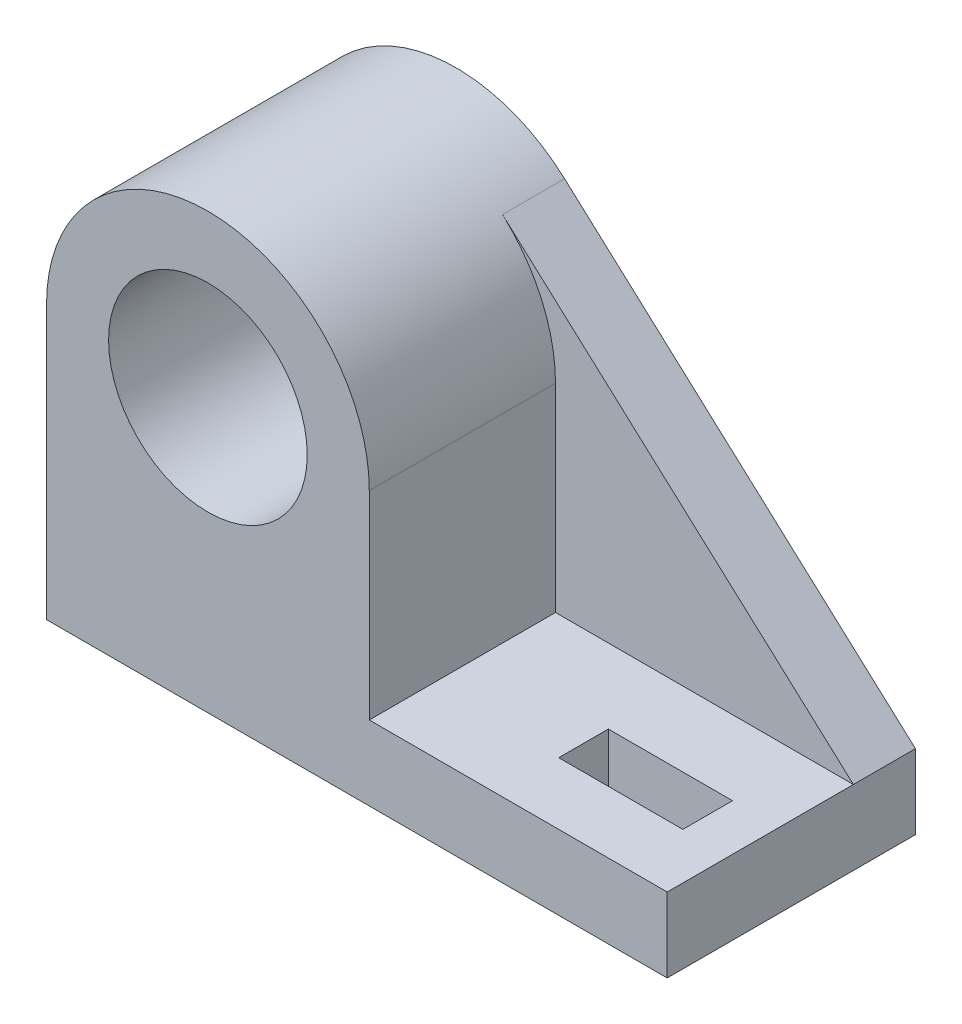
ISO-10303-21;
HEADER;
FILE_DESCRIPTION(('STEP AP214'),'2;1');
FILE_NAME('part.step','',(''),(''),'','','');
FILE_SCHEMA(('AUTOMOTIVE_DESIGN { 1 0 10303 214 1 1 1 1 }'));
ENDSEC;
DATA;
#1=APPLICATION_CONTEXT('core data for automotive mechanical design processes');
#2=APPLICATION_PROTOCOL_DEFINITION('international standard','automotive_design',2000,#1);
#3=PRODUCT_CONTEXT('',#1,'mechanical');
#4=PRODUCT('Part','Part','',(#3));
#5=PRODUCT_RELATED_PRODUCT_CATEGORY('part','',(#4));
#6=PRODUCT_DEFINITION_FORMATION('','',#4);
#7=PRODUCT_DEFINITION_CONTEXT('part definition',#1,'design');
#8=PRODUCT_DEFINITION('design','',#6,#7);
#9=PRODUCT_DEFINITION_SHAPE('','',#8);
#10=(LENGTH_UNIT() NAMED_UNIT(*) SI_UNIT(.MILLI.,.METRE.));
#11=(NAMED_UNIT(*) PLANE_ANGLE_UNIT() SI_UNIT($,.RADIAN.));
#12=(NAMED_UNIT(*) SI_UNIT($,.STERADIAN.) SOLID_ANGLE_UNIT());
#13=UNCERTAINTY_MEASURE_WITH_UNIT(LENGTH_MEASURE(1.E-05),#10,'distance_accuracy_value','');
#14=(GEOMETRIC_REPRESENTATION_CONTEXT(3) GLOBAL_UNCERTAINTY_ASSIGNED_CONTEXT((#13)) GLOBAL_UNIT_ASSIGNED_CONTEXT((#10,
#11,#12)) REPRESENTATION_CONTEXT('',''));
#15=CARTESIAN_POINT('',(0.,0.,0.));
#16=DIRECTION('',(0.,0.,1.));
#17=DIRECTION('',(1.,0.,0.));
#18=AXIS2_PLACEMENT_3D('',#15,#16,#17);
#19=CARTESIAN_POINT('',(-44.9626865671642,12.,-40.));
#20=DIRECTION('',(-1.,0.,0.));
#21=DIRECTION('',(0.,0.,1.));
#22=AXIS2_PLACEMENT_3D('',#19,#20,#21);
#23=PLANE('',#22);
#24=DIRECTION('',(0.,-1.,0.));
#25=VECTOR('',#24,1.);
#26=CARTESIAN_POINT('',(-44.9626865671642,12.,0.));
#27=LINE('',#26,#25);
#28=CARTESIAN_POINT('',(-44.9626865671642,44.,0.));
#29=VERTEX_POINT('',#28);
#30=CARTESIAN_POINT('',(-44.9626865671642,0.,0.));
#31=VERTEX_POINT('',#30);
#32=EDGE_CURVE('E177',#29,#31,#27,.T.);
#33=ORIENTED_EDGE('',*,*,#32,.F.);
#34=DIRECTION('',(0.,0.,1.));
#35=VECTOR('',#34,1.);
#36=CARTESIAN_POINT('',(-44.9626865671642,44.,-40.));
#37=LINE('',#36,#35);
#38=CARTESIAN_POINT('',(-44.9626865671642,44.,-40.));
#39=VERTEX_POINT('',#38);
#40=EDGE_CURVE('E201',#39,#29,#37,.T.);
#41=ORIENTED_EDGE('',*,*,#40,.F.);
#42=DIRECTION('',(0.,-1.,0.));
#43=VECTOR('',#42,1.);
#44=CARTESIAN_POINT('',(-44.9626865671642,0.,-40.));
#45=LINE('',#44,#43);
#46=CARTESIAN_POINT('',(-44.9626865671642,0.,-40.));
#47=VERTEX_POINT('',#46);
#48=EDGE_CURVE('E173',#39,#47,#45,.T.);
#49=ORIENTED_EDGE('',*,*,#48,.T.);
#50=DIRECTION('',(0.,0.,1.));
#51=VECTOR('',#50,1.);
#52=CARTESIAN_POINT('',(-44.9626865671642,0.,-40.));
#53=LINE('',#52,#51);
#54=EDGE_CURVE('E184',#47,#31,#53,.T.);
#55=ORIENTED_EDGE('',*,*,#54,.T.);
#56=EDGE_LOOP('',(#33,#41,#49,#55));
#57=FACE_BOUND('',#56,.T.);
#58=ADVANCED_FACE('F36',(#57),#23,.T.);
#59=CARTESIAN_POINT('',(-18.9626865671642,44.,-40.));
#60=DIRECTION('',(0.,0.,1.));
#61=DIRECTION('',(1.,0.,0.));
#62=AXIS2_PLACEMENT_3D('',#59,#60,#61);
#63=CYLINDRICAL_SURFACE('',#62,26.);
#64=CARTESIAN_POINT('',(-18.9626865671642,44.,-30.));
#65=DIRECTION('',(0.,0.,1.));
#66=DIRECTION('',(1.,0.,0.));
#67=AXIS2_PLACEMENT_3D('',#64,#65,#66);
#68=CIRCLE('',#67,26.);
#69=CARTESIAN_POINT('',(-1.49834914465468,63.2612802895533,-30.));
#70=VERTEX_POINT('',#69);
#71=CARTESIAN_POINT('',(7.03731343283581,44.,-30.));
#72=VERTEX_POINT('',#71);
#73=EDGE_CURVE('E161',#70,#72,#68,.F.);
#74=ORIENTED_EDGE('',*,*,#73,.F.);
#75=DIRECTION('',(0.,0.,1.));
#76=VECTOR('',#75,1.);
#77=CARTESIAN_POINT('',(-1.49834914465467,63.2612802895533,-40.));
#78=LINE('',#77,#76);
#79=CARTESIAN_POINT('',(-1.49834914465468,63.2612802895533,-40.));
#80=VERTEX_POINT('',#79);
#81=EDGE_CURVE('E164',#70,#80,#78,.F.);
#82=ORIENTED_EDGE('',*,*,#81,.T.);
#83=CARTESIAN_POINT('',(-18.9626865671642,44.,-40.));
#84=DIRECTION('',(0.,0.,1.));
#85=DIRECTION('',(-1.,0.,0.));
#86=AXIS2_PLACEMENT_3D('',#83,#84,#85);
#87=CIRCLE('',#86,26.);
#88=EDGE_CURVE('E182',#80,#39,#87,.T.);
#89=ORIENTED_EDGE('',*,*,#88,.T.);
#90=ORIENTED_EDGE('',*,*,#40,.T.);
#91=CARTESIAN_POINT('',(-18.9626865671642,44.,0.));
#92=DIRECTION('',(0.,0.,1.));
#93=DIRECTION('',(-1.,0.,0.));
#94=AXIS2_PLACEMENT_3D('',#91,#92,#93);
#95=CIRCLE('',#94,26.);
#96=CARTESIAN_POINT('',(7.03731343283581,44.,0.));
#97=VERTEX_POINT('',#96);
#98=EDGE_CURVE('E196',#97,#29,#95,.T.);
#99=ORIENTED_EDGE('',*,*,#98,.F.);
#100=DIRECTION('',(0.,0.,1.));
#101=VECTOR('',#100,1.);
#102=CARTESIAN_POINT('',(7.03731343283581,44.,-40.));
#103=LINE('',#102,#101);
#104=EDGE_CURVE('E204',#72,#97,#103,.T.);
#105=ORIENTED_EDGE('',*,*,#104,.F.);
#106=EDGE_LOOP('',(#74,#82,#89,#90,#99,#105));
#107=FACE_BOUND('',#106,.T.);
#108=ADVANCED_FACE('F237',(#107),#63,.T.);
#109=CARTESIAN_POINT('',(7.03731343283581,12.,-40.));
#110=DIRECTION('',(1.,0.,0.));
#111=DIRECTION('',(0.,0.,-1.));
#112=AXIS2_PLACEMENT_3D('',#109,#110,#111);
#113=PLANE('',#112);
#114=DIRECTION('',(0.,-1.,0.));
#115=VECTOR('',#114,1.);
#116=CARTESIAN_POINT('',(7.03731343283581,12.,-30.));
#117=LINE('',#116,#115);
#118=CARTESIAN_POINT('',(7.03731343283581,12.,-30.));
#119=VERTEX_POINT('',#118);
#120=EDGE_CURVE('E158',#72,#119,#117,.T.);
#121=ORIENTED_EDGE('',*,*,#120,.F.);
#122=ORIENTED_EDGE('',*,*,#104,.T.);
#123=DIRECTION('',(0.,1.,0.));
#124=VECTOR('',#123,1.);
#125=CARTESIAN_POINT('',(7.03731343283581,12.,0.));
#126=LINE('',#125,#124);
#127=CARTESIAN_POINT('',(7.03731343283581,12.,0.));
#128=VERTEX_POINT('',#127);
#129=EDGE_CURVE('E193',#128,#97,#126,.T.);
#130=ORIENTED_EDGE('',*,*,#129,.F.);
#131=DIRECTION('',(0.,0.,1.));
#132=VECTOR('',#131,1.);
#133=CARTESIAN_POINT('',(7.03731343283581,12.,-40.));
#134=LINE('',#133,#132);
#135=EDGE_CURVE('E206',#119,#128,#134,.T.);
#136=ORIENTED_EDGE('',*,*,#135,.F.);
#137=EDGE_LOOP('',(#121,#122,#130,#136));
#138=FACE_BOUND('',#137,.T.);
#139=ADVANCED_FACE('F243',(#138),#113,.T.);
#140=CARTESIAN_POINT('',(7.03731343283581,12.,-40.));
#141=DIRECTION('',(0.,1.,0.));
#142=DIRECTION('',(0.,0.,1.));
#143=AXIS2_PLACEMENT_3D('',#140,#141,#142);
#144=PLANE('',#143);
#145=DIRECTION('',(0.,0.,-1.));
#146=VECTOR('',#145,1.);
#147=CARTESIAN_POINT('',(47.5595856633928,12.,-18.));
#148=LINE('',#147,#146);
#149=CARTESIAN_POINT('',(47.5595856633928,12.,-10.));
#150=VERTEX_POINT('',#149);
#151=CARTESIAN_POINT('',(47.5595856633928,12.,-18.));
#152=VERTEX_POINT('',#151);
#153=EDGE_CURVE('E51',#150,#152,#148,.T.);
#154=ORIENTED_EDGE('',*,*,#153,.F.);
#155=DIRECTION('',(1.,0.,0.));
#156=VECTOR('',#155,1.);
#157=CARTESIAN_POINT('',(27.5595856633928,12.,-10.));
#158=LINE('',#157,#156);
#159=CARTESIAN_POINT('',(27.5595856633928,12.,-10.));
#160=VERTEX_POINT('',#159);
#161=EDGE_CURVE('E140',#160,#150,#158,.T.);
#162=ORIENTED_EDGE('',*,*,#161,.F.);
#163=DIRECTION('',(0.,0.,1.));
#164=VECTOR('',#163,1.);
#165=CARTESIAN_POINT('',(27.5595856633928,12.,-10.));
#166=LINE('',#165,#164);
#167=CARTESIAN_POINT('',(27.5595856633928,12.,-18.));
#168=VERTEX_POINT('',#167);
#169=EDGE_CURVE('E124',#168,#160,#166,.T.);
#170=ORIENTED_EDGE('',*,*,#169,.F.);
#171=DIRECTION('',(-1.,0.,0.));
#172=VECTOR('',#171,1.);
#173=CARTESIAN_POINT('',(47.5595856633928,12.,-18.));
#174=LINE('',#173,#172);
#175=EDGE_CURVE('E133',#152,#168,#174,.T.);
#176=ORIENTED_EDGE('',*,*,#175,.F.);
#177=EDGE_LOOP('',(#154,#162,#170,#176));
#178=FACE_BOUND('',#177,.T.);
#179=DIRECTION('',(1.,0.,0.));
#180=VECTOR('',#179,1.);
#181=CARTESIAN_POINT('',(7.03731343283581,12.,-30.));
#182=LINE('',#181,#180);
#183=CARTESIAN_POINT('',(55.0373134328358,12.,-30.));
#184=VERTEX_POINT('',#183);
#185=EDGE_CURVE('E153',#119,#184,#182,.T.);
#186=ORIENTED_EDGE('',*,*,#185,.F.);
#187=ORIENTED_EDGE('',*,*,#135,.T.);
#188=DIRECTION('',(-1.,0.,0.));
#189=VECTOR('',#188,1.);
#190=CARTESIAN_POINT('',(7.03731343283581,12.,0.));
#191=LINE('',#190,#189);
#192=CARTESIAN_POINT('',(55.0373134328358,12.,0.));
#193=VERTEX_POINT('',#192);
#194=EDGE_CURVE('E190',#193,#128,#191,.T.);
#195=ORIENTED_EDGE('',*,*,#194,.F.);
#196=DIRECTION('',(0.,0.,1.));
#197=VECTOR('',#196,1.);
#198=CARTESIAN_POINT('',(55.0373134328358,12.,-40.));
#199=LINE('',#198,#197);
#200=EDGE_CURVE('E211',#184,#193,#199,.T.);
#201=ORIENTED_EDGE('',*,*,#200,.F.);
#202=EDGE_LOOP('',(#186,#187,#195,#201));
#203=FACE_BOUND('',#202,.T.);
#204=ADVANCED_FACE('F137',(#178,#203),#144,.T.);
#205=CARTESIAN_POINT('',(55.0373134328358,0.,-40.));
#206=DIRECTION('',(1.,0.,0.));
#207=DIRECTION('',(0.,0.,-1.));
#208=AXIS2_PLACEMENT_3D('',#205,#206,#207);
#209=PLANE('',#208);
#210=DIRECTION('',(0.,1.,0.));
#211=VECTOR('',#210,1.);
#212=CARTESIAN_POINT('',(55.0373134328358,0.,0.));
#213=LINE('',#212,#211);
#214=CARTESIAN_POINT('',(55.0373134328358,0.,0.));
#215=VERTEX_POINT('',#214);
#216=EDGE_CURVE('E187',#215,#193,#213,.T.);
#217=ORIENTED_EDGE('',*,*,#216,.F.);
#218=DIRECTION('',(0.,0.,1.));
#219=VECTOR('',#218,1.);
#220=CARTESIAN_POINT('',(55.0373134328358,0.,-40.));
#221=LINE('',#220,#219);
#222=CARTESIAN_POINT('',(55.0373134328358,0.,-40.));
#223=VERTEX_POINT('',#222);
#224=EDGE_CURVE('E212',#223,#215,#221,.T.);
#225=ORIENTED_EDGE('',*,*,#224,.F.);
#226=DIRECTION('',(0.,1.,0.));
#227=VECTOR('',#226,1.);
#228=CARTESIAN_POINT('',(55.0373134328358,0.,-40.));
#229=LINE('',#228,#227);
#230=CARTESIAN_POINT('',(55.0373134328358,12.,-40.));
#231=VERTEX_POINT('',#230);
#232=EDGE_CURVE('E180',#223,#231,#229,.T.);
#233=ORIENTED_EDGE('',*,*,#232,.T.);
#234=EDGE_CURVE('E208',#231,#184,#199,.T.);
#235=ORIENTED_EDGE('',*,*,#234,.T.);
#236=ORIENTED_EDGE('',*,*,#200,.T.);
#237=EDGE_LOOP('',(#217,#225,#233,#235,#236));
#238=FACE_BOUND('',#237,.T.);
#239=ADVANCED_FACE('F255',(#238),#209,.T.);
#240=CARTESIAN_POINT('',(-44.9626865671642,0.,-40.));
#241=DIRECTION('',(0.,-1.,0.));
#242=DIRECTION('',(0.,0.,-1.));
#243=AXIS2_PLACEMENT_3D('',#240,#241,#242);
#244=PLANE('',#243);
#245=DIRECTION('',(0.,0.,1.));
#246=VECTOR('',#245,1.);
#247=CARTESIAN_POINT('',(47.5595856633928,0.,-40.));
#248=LINE('',#247,#246);
#249=CARTESIAN_POINT('',(47.5595856633928,0.,-18.));
#250=VERTEX_POINT('',#249);
#251=CARTESIAN_POINT('',(47.5595856633928,0.,-10.));
#252=VERTEX_POINT('',#251);
#253=EDGE_CURVE('E11',#250,#252,#248,.T.);
#254=ORIENTED_EDGE('',*,*,#253,.F.);
#255=DIRECTION('',(1.,0.,0.));
#256=VECTOR('',#255,1.);
#257=CARTESIAN_POINT('',(-44.9626865671642,0.,-18.));
#258=LINE('',#257,#256);
#259=CARTESIAN_POINT('',(27.5595856633928,0.,-18.));
#260=VERTEX_POINT('',#259);
#261=EDGE_CURVE('E203',#260,#250,#258,.T.);
#262=ORIENTED_EDGE('',*,*,#261,.F.);
#263=DIRECTION('',(0.,0.,-1.));
#264=VECTOR('',#263,1.);
#265=CARTESIAN_POINT('',(27.5595856633928,0.,-40.));
#266=LINE('',#265,#264);
#267=CARTESIAN_POINT('',(27.5595856633928,0.,-10.));
#268=VERTEX_POINT('',#267);
#269=EDGE_CURVE('E127',#268,#260,#266,.T.);
#270=ORIENTED_EDGE('',*,*,#269,.F.);
#271=DIRECTION('',(-1.,0.,0.));
#272=VECTOR('',#271,1.);
#273=CARTESIAN_POINT('',(-44.9626865671642,0.,-9.99999999999999));
#274=LINE('',#273,#272);
#275=EDGE_CURVE('E44',#252,#268,#274,.T.);
#276=ORIENTED_EDGE('',*,*,#275,.F.);
#277=EDGE_LOOP('',(#254,#262,#270,#276));
#278=FACE_BOUND('',#277,.T.);
#279=DIRECTION('',(1.,0.,0.));
#280=VECTOR('',#279,1.);
#281=CARTESIAN_POINT('',(-44.9626865671642,0.,0.));
#282=LINE('',#281,#280);
#283=EDGE_CURVE('E170',#31,#215,#282,.T.);
#284=ORIENTED_EDGE('',*,*,#283,.F.);
#285=ORIENTED_EDGE('',*,*,#54,.F.);
#286=DIRECTION('',(1.,0.,0.));
#287=VECTOR('',#286,1.);
#288=CARTESIAN_POINT('',(-44.9626865671642,0.,-40.));
#289=LINE('',#288,#287);
#290=EDGE_CURVE('E176',#47,#223,#289,.T.);
#291=ORIENTED_EDGE('',*,*,#290,.T.);
#292=ORIENTED_EDGE('',*,*,#224,.T.);
#293=EDGE_LOOP('',(#284,#285,#291,#292));
#294=FACE_BOUND('',#293,.T.);
#295=ADVANCED_FACE('F38',(#278,#294),#244,.T.);
#296=CARTESIAN_POINT('',(-18.9626865671642,44.,-40.));
#297=DIRECTION('',(0.,0.,-1.));
#298=DIRECTION('',(-1.,0.,0.));
#299=AXIS2_PLACEMENT_3D('',#296,#297,#298);
#300=PLANE('',#299);
#301=ORIENTED_EDGE('',*,*,#88,.F.);
#302=DIRECTION('',(-0.740818472675126,0.671705285481135,0.));
#303=VECTOR('',#302,1.);
#304=CARTESIAN_POINT('',(55.0373134328358,12.,-40.));
#305=LINE('',#304,#303);
#306=EDGE_CURVE('E147',#231,#80,#305,.T.);
#307=ORIENTED_EDGE('',*,*,#306,.F.);
#308=ORIENTED_EDGE('',*,*,#232,.F.);
#309=ORIENTED_EDGE('',*,*,#290,.F.);
#310=ORIENTED_EDGE('',*,*,#48,.F.);
#311=EDGE_LOOP('',(#301,#307,#308,#309,#310));
#312=FACE_BOUND('',#311,.T.);
#313=CARTESIAN_POINT('',(-18.9626865671642,44.,-40.));
#314=DIRECTION('',(0.,0.,1.));
#315=DIRECTION('',(1.,0.,0.));
#316=AXIS2_PLACEMENT_3D('',#313,#314,#315);
#317=CIRCLE('',#316,16.);
#318=CARTESIAN_POINT('',(-2.96268656716419,44.,-40.));
#319=VERTEX_POINT('',#318);
#320=EDGE_CURVE('E167',#319,#319,#317,.T.);
#321=ORIENTED_EDGE('',*,*,#320,.T.);
#322=EDGE_LOOP('',(#321));
#323=FACE_BOUND('',#322,.T.);
#324=ADVANCED_FACE('F261',(#312,#323),#300,.T.);
#325=CARTESIAN_POINT('',(-18.9626865671642,44.,0.));
#326=DIRECTION('',(0.,0.,-1.));
#327=DIRECTION('',(-1.,0.,0.));
#328=AXIS2_PLACEMENT_3D('',#325,#326,#327);
#329=PLANE('',#328);
#330=CARTESIAN_POINT('',(-18.9626865671642,44.,0.));
#331=DIRECTION('',(0.,0.,1.));
#332=DIRECTION('',(1.,0.,0.));
#333=AXIS2_PLACEMENT_3D('',#330,#331,#332);
#334=CIRCLE('',#333,16.);
#335=CARTESIAN_POINT('',(-2.96268656716419,44.,0.));
#336=VERTEX_POINT('',#335);
#337=EDGE_CURVE('E166',#336,#336,#334,.T.);
#338=ORIENTED_EDGE('',*,*,#337,.F.);
#339=EDGE_LOOP('',(#338));
#340=FACE_BOUND('',#339,.T.);
#341=ORIENTED_EDGE('',*,*,#32,.T.);
#342=ORIENTED_EDGE('',*,*,#283,.T.);
#343=ORIENTED_EDGE('',*,*,#216,.T.);
#344=ORIENTED_EDGE('',*,*,#194,.T.);
#345=ORIENTED_EDGE('',*,*,#129,.T.);
#346=ORIENTED_EDGE('',*,*,#98,.T.);
#347=EDGE_LOOP('',(#341,#342,#343,#344,#345,#346));
#348=FACE_BOUND('',#347,.T.);
#349=ADVANCED_FACE('F248',(#340,#348),#329,.F.);
#350=CARTESIAN_POINT('',(-18.9626865671642,44.,-40.));
#351=DIRECTION('',(0.,0.,1.));
#352=DIRECTION('',(1.,0.,0.));
#353=AXIS2_PLACEMENT_3D('',#350,#351,#352);
#354=CYLINDRICAL_SURFACE('',#353,16.);
#355=CARTESIAN_POINT('',(-2.96268656716419,44.,0.));
#356=CARTESIAN_POINT('',(-2.96268656716419,44.,-0.416666666666667));
#357=CARTESIAN_POINT('',(-2.96268656716419,44.,-0.833333333333334));
#358=CARTESIAN_POINT('',(-2.96268656716419,44.,-1.66666666666667));
#359=CARTESIAN_POINT('',(-2.96268656716419,44.,-2.08333333333334));
#360=CARTESIAN_POINT('',(-2.96268656716419,44.,-2.91666666666667));
#361=CARTESIAN_POINT('',(-2.96268656716419,44.,-3.33333333333334));
#362=CARTESIAN_POINT('',(-2.96268656716419,44.,-4.16666666666667));
#363=CARTESIAN_POINT('',(-2.96268656716419,44.,-4.58333333333334));
#364=CARTESIAN_POINT('',(-2.96268656716419,44.,-5.41666666666667));
#365=CARTESIAN_POINT('',(-2.96268656716419,44.,-5.83333333333334));
#366=CARTESIAN_POINT('',(-2.96268656716419,44.,-6.66666666666667));
#367=CARTESIAN_POINT('',(-2.96268656716419,44.,-7.08333333333334));
#368=CARTESIAN_POINT('',(-2.96268656716419,44.,-7.91666666666667));
#369=CARTESIAN_POINT('',(-2.96268656716419,44.,-8.33333333333334));
#370=CARTESIAN_POINT('',(-2.96268656716419,44.,-9.16666666666667));
#371=CARTESIAN_POINT('',(-2.96268656716419,44.,-9.58333333333334));
#372=CARTESIAN_POINT('',(-2.96268656716419,44.,-10.4166666666667));
#373=CARTESIAN_POINT('',(-2.96268656716419,44.,-10.8333333333333));
#374=CARTESIAN_POINT('',(-2.96268656716419,44.,-11.6666666666667));
#375=CARTESIAN_POINT('',(-2.96268656716419,44.,-12.0833333333333));
#376=CARTESIAN_POINT('',(-2.96268656716419,44.,-12.9166666666667));
#377=CARTESIAN_POINT('',(-2.96268656716419,44.,-13.3333333333333));
#378=CARTESIAN_POINT('',(-2.96268656716419,44.,-14.1666666666667));
#379=CARTESIAN_POINT('',(-2.96268656716419,44.,-14.5833333333333));
#380=CARTESIAN_POINT('',(-2.96268656716419,44.,-15.4166666666667));
#381=CARTESIAN_POINT('',(-2.96268656716419,44.,-15.8333333333333));
#382=CARTESIAN_POINT('',(-2.96268656716419,44.,-16.6666666666667));
#383=CARTESIAN_POINT('',(-2.96268656716419,44.,-17.0833333333333));
#384=CARTESIAN_POINT('',(-2.96268656716419,44.,-17.9166666666667));
#385=CARTESIAN_POINT('',(-2.96268656716419,44.,-18.3333333333333));
#386=CARTESIAN_POINT('',(-2.96268656716419,44.,-19.1666666666667));
#387=CARTESIAN_POINT('',(-2.96268656716419,44.,-19.5833333333333));
#388=CARTESIAN_POINT('',(-2.96268656716419,44.,-20.4166666666667));
#389=CARTESIAN_POINT('',(-2.96268656716419,44.,-20.8333333333333));
#390=CARTESIAN_POINT('',(-2.96268656716419,44.,-21.6666666666667));
#391=CARTESIAN_POINT('',(-2.96268656716419,44.,-22.0833333333333));
#392=CARTESIAN_POINT('',(-2.96268656716419,44.,-22.9166666666667));
#393=CARTESIAN_POINT('',(-2.96268656716419,44.,-23.3333333333333));
#394=CARTESIAN_POINT('',(-2.96268656716419,44.,-24.1666666666667));
#395=CARTESIAN_POINT('',(-2.96268656716419,44.,-24.5833333333333));
#396=CARTESIAN_POINT('',(-2.96268656716419,44.,-25.4166666666667));
#397=CARTESIAN_POINT('',(-2.96268656716419,44.,-25.8333333333333));
#398=CARTESIAN_POINT('',(-2.96268656716419,44.,-26.6666666666667));
#399=CARTESIAN_POINT('',(-2.96268656716419,44.,-27.0833333333333));
#400=CARTESIAN_POINT('',(-2.96268656716419,44.,-27.9166666666667));
#401=CARTESIAN_POINT('',(-2.96268656716419,44.,-28.3333333333333));
#402=CARTESIAN_POINT('',(-2.96268656716419,44.,-29.1666666666667));
#403=CARTESIAN_POINT('',(-2.96268656716419,44.,-29.5833333333333));
#404=CARTESIAN_POINT('',(-2.96268656716419,44.,-30.4166666666667));
#405=CARTESIAN_POINT('',(-2.96268656716419,44.,-30.8333333333333));
#406=CARTESIAN_POINT('',(-2.96268656716419,44.,-31.6666666666667));
#407=CARTESIAN_POINT('',(-2.96268656716419,44.,-32.0833333333333));
#408=CARTESIAN_POINT('',(-2.96268656716419,44.,-32.9166666666667));
#409=CARTESIAN_POINT('',(-2.96268656716419,44.,-33.3333333333333));
#410=CARTESIAN_POINT('',(-2.96268656716419,44.,-34.1666666666667));
#411=CARTESIAN_POINT('',(-2.96268656716419,44.,-34.5833333333333));
#412=CARTESIAN_POINT('',(-2.96268656716419,44.,-35.4166666666667));
#413=CARTESIAN_POINT('',(-2.96268656716419,44.,-35.8333333333333));
#414=CARTESIAN_POINT('',(-2.96268656716419,44.,-36.6666666666667));
#415=CARTESIAN_POINT('',(-2.96268656716419,44.,-37.0833333333333));
#416=CARTESIAN_POINT('',(-2.96268656716419,44.,-37.9166666666667));
#417=CARTESIAN_POINT('',(-2.96268656716419,44.,-38.3333333333333));
#418=CARTESIAN_POINT('',(-2.96268656716419,44.,-39.1666666666667));
#419=CARTESIAN_POINT('',(-2.96268656716419,44.,-39.5833333333333));
#420=CARTESIAN_POINT('',(-2.96268656716419,44.,-40.));
#421=B_SPLINE_CURVE_WITH_KNOTS('',3,(#355,#356,#357,#358,#359,#360,#361,#362,#363,#364,#365,
#366,#367,#368,#369,#370,#371,#372,#373,#374,#375,#376,#377,#378,#379,#380,#381,#382,#383,#384,
#385,#386,#387,#388,#389,#390,#391,#392,#393,#394,#395,#396,#397,#398,#399,#400,#401,#402,#403,
#404,#405,#406,#407,#408,#409,#410,#411,#412,#413,#414,#415,#416,#417,#418,#419,#420),
.UNSPECIFIED.,.F.,.F.,(4,2,2,2,2,2,2,2,2,2,2,2,2,2,2,2,2,2,2,2,2,2,2,2,2,2,2,2,2,2,2,2,4),(0.,
1.25,2.5,3.75,5.,6.25000000000001,7.50000000000001,8.75000000000001,10.,11.25,12.5,13.75,15.,
16.25,17.5,18.75,20.,21.25,22.5,23.75,25.,26.25,27.5,28.75,30.,31.25,32.5,33.75,35.,36.25,37.5,
38.75,40.),.UNSPECIFIED.);
#422=EDGE_CURVE('BSEAM283',#336,#319,#421,.T.);
#423=ORIENTED_EDGE('',*,*,#337,.T.);
#424=ORIENTED_EDGE('',*,*,#320,.F.);
#425=ORIENTED_EDGE('',*,*,#422,.T.);
#426=ORIENTED_EDGE('',*,*,#422,.F.);
#427=EDGE_LOOP('',(#423,#425,#424,#426));
#428=FACE_BOUND('',#427,.T.);
#429=ADVANCED_FACE('F283',(#428),#354,.F.);
#430=CARTESIAN_POINT('',(55.0373134328358,12.,-40.));
#431=DIRECTION('',(0.671705285481135,0.740818472675126,0.));
#432=DIRECTION('',(-0.740818472675126,0.671705285481135,0.));
#433=AXIS2_PLACEMENT_3D('',#430,#431,#432);
#434=PLANE('',#433);
#435=ORIENTED_EDGE('',*,*,#81,.F.);
#436=DIRECTION('',(-0.740818472675126,0.671705285481135,0.));
#437=VECTOR('',#436,1.);
#438=CARTESIAN_POINT('',(55.0373134328358,12.,-30.));
#439=LINE('',#438,#437);
#440=EDGE_CURVE('E150',#184,#70,#439,.T.);
#441=ORIENTED_EDGE('',*,*,#440,.F.);
#442=ORIENTED_EDGE('',*,*,#234,.F.);
#443=ORIENTED_EDGE('',*,*,#306,.T.);
#444=EDGE_LOOP('',(#435,#441,#442,#443));
#445=FACE_BOUND('',#444,.T.);
#446=ADVANCED_FACE('F232',(#445),#434,.T.);
#447=CARTESIAN_POINT('',(5.03731343283581,35.,-30.));
#448=DIRECTION('',(0.,0.,1.));
#449=DIRECTION('',(1.,0.,0.));
#450=AXIS2_PLACEMENT_3D('',#447,#448,#449);
#451=PLANE('',#450);
#452=ORIENTED_EDGE('',*,*,#440,.T.);
#453=ORIENTED_EDGE('',*,*,#73,.T.);
#454=ORIENTED_EDGE('',*,*,#120,.T.);
#455=ORIENTED_EDGE('',*,*,#185,.T.);
#456=EDGE_LOOP('',(#452,#453,#454,#455));
#457=FACE_BOUND('',#456,.T.);
#458=ADVANCED_FACE('F225',(#457),#451,.T.);
#459=CARTESIAN_POINT('',(47.5595856633928,-28.,-18.));
#460=DIRECTION('',(1.,0.,0.));
#461=DIRECTION('',(0.,0.,-1.));
#462=AXIS2_PLACEMENT_3D('',#459,#460,#461);
#463=PLANE('',#462);
#464=ORIENTED_EDGE('',*,*,#253,.T.);
#465=DIRECTION('',(0.,1.,0.));
#466=VECTOR('',#465,1.);
#467=CARTESIAN_POINT('',(47.5595856633928,-28.,-10.));
#468=LINE('',#467,#466);
#469=EDGE_CURVE('E145',#252,#150,#468,.T.);
#470=ORIENTED_EDGE('',*,*,#469,.T.);
#471=ORIENTED_EDGE('',*,*,#153,.T.);
#472=DIRECTION('',(0.,1.,0.));
#473=VECTOR('',#472,1.);
#474=CARTESIAN_POINT('',(47.5595856633928,-28.,-18.));
#475=LINE('',#474,#473);
#476=EDGE_CURVE('E130',#250,#152,#475,.T.);
#477=ORIENTED_EDGE('',*,*,#476,.F.);
#478=EDGE_LOOP('',(#464,#470,#471,#477));
#479=FACE_BOUND('',#478,.T.);
#480=ADVANCED_FACE('F223',(#479),#463,.F.);
#481=CARTESIAN_POINT('',(27.5595856633928,-28.,-10.));
#482=DIRECTION('',(0.,0.,1.));
#483=DIRECTION('',(1.,0.,0.));
#484=AXIS2_PLACEMENT_3D('',#481,#482,#483);
#485=PLANE('',#484);
#486=ORIENTED_EDGE('',*,*,#275,.T.);
#487=DIRECTION('',(0.,1.,0.));
#488=VECTOR('',#487,1.);
#489=CARTESIAN_POINT('',(27.5595856633928,-28.,-10.));
#490=LINE('',#489,#488);
#491=EDGE_CURVE('E129',#268,#160,#490,.T.);
#492=ORIENTED_EDGE('',*,*,#491,.T.);
#493=ORIENTED_EDGE('',*,*,#161,.T.);
#494=ORIENTED_EDGE('',*,*,#469,.F.);
#495=EDGE_LOOP('',(#486,#492,#493,#494));
#496=FACE_BOUND('',#495,.T.);
#497=ADVANCED_FACE('F219',(#496),#485,.F.);
#498=CARTESIAN_POINT('',(27.5595856633928,-28.,-10.));
#499=DIRECTION('',(-1.,0.,0.));
#500=DIRECTION('',(0.,0.,1.));
#501=AXIS2_PLACEMENT_3D('',#498,#499,#500);
#502=PLANE('',#501);
#503=ORIENTED_EDGE('',*,*,#269,.T.);
#504=DIRECTION('',(0.,1.,0.));
#505=VECTOR('',#504,1.);
#506=CARTESIAN_POINT('',(27.5595856633928,-28.,-18.));
#507=LINE('',#506,#505);
#508=EDGE_CURVE('E59',#260,#168,#507,.T.);
#509=ORIENTED_EDGE('',*,*,#508,.T.);
#510=ORIENTED_EDGE('',*,*,#169,.T.);
#511=ORIENTED_EDGE('',*,*,#491,.F.);
#512=EDGE_LOOP('',(#503,#509,#510,#511));
#513=FACE_BOUND('',#512,.T.);
#514=ADVANCED_FACE('F121',(#513),#502,.F.);
#515=CARTESIAN_POINT('',(47.5595856633928,-28.,-18.));
#516=DIRECTION('',(0.,0.,-1.));
#517=DIRECTION('',(-1.,0.,0.));
#518=AXIS2_PLACEMENT_3D('',#515,#516,#517);
#519=PLANE('',#518);
#520=ORIENTED_EDGE('',*,*,#261,.T.);
#521=ORIENTED_EDGE('',*,*,#476,.T.);
#522=ORIENTED_EDGE('',*,*,#175,.T.);
#523=ORIENTED_EDGE('',*,*,#508,.F.);
#524=EDGE_LOOP('',(#520,#521,#522,#523));
#525=FACE_BOUND('',#524,.T.);
#526=ADVANCED_FACE('F134',(#525),#519,.F.);
#527=CLOSED_SHELL('',(#58,#108,#139,#204,#239,#295,#324,#349,#429,#446,#458,#480,#497,#514,#526));
#528=MANIFOLD_SOLID_BREP('B2',#527);
#529=ADVANCED_BREP_SHAPE_REPRESENTATION('',(#18,#528),#14);
#530=SHAPE_DEFINITION_REPRESENTATION(#9,#529);
ENDSEC;
END-ISO-10303-21;
